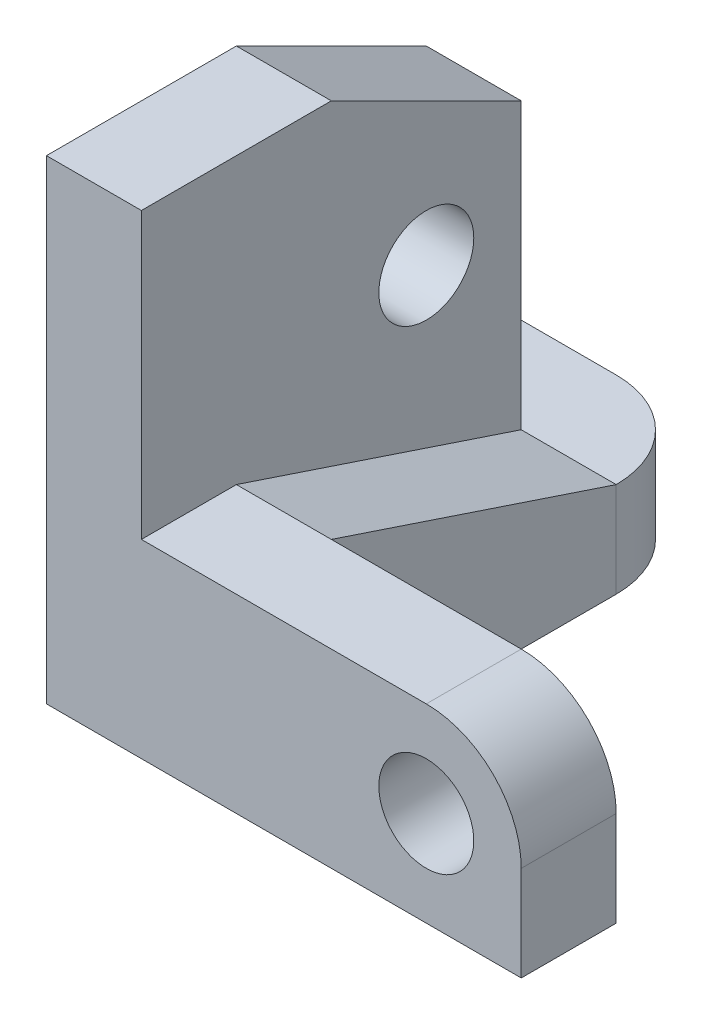
ISO-10303-21;
HEADER;
FILE_DESCRIPTION(('STEP AP214'),'2;1');
FILE_NAME('part.step','',(''),(''),'','','');
FILE_SCHEMA(('AUTOMOTIVE_DESIGN { 1 0 10303 214 1 1 1 1 }'));
ENDSEC;
DATA;
#1=APPLICATION_CONTEXT('core data for automotive mechanical design processes');
#2=APPLICATION_PROTOCOL_DEFINITION('international standard','automotive_design',2000,#1);
#3=PRODUCT_CONTEXT('',#1,'mechanical');
#4=PRODUCT('Part','Part','',(#3));
#5=PRODUCT_RELATED_PRODUCT_CATEGORY('part','',(#4));
#6=PRODUCT_DEFINITION_FORMATION('','',#4);
#7=PRODUCT_DEFINITION_CONTEXT('part definition',#1,'design');
#8=PRODUCT_DEFINITION('design','',#6,#7);
#9=PRODUCT_DEFINITION_SHAPE('','',#8);
#10=(LENGTH_UNIT() NAMED_UNIT(*) SI_UNIT(.MILLI.,.METRE.));
#11=(NAMED_UNIT(*) PLANE_ANGLE_UNIT() SI_UNIT($,.RADIAN.));
#12=(NAMED_UNIT(*) SI_UNIT($,.STERADIAN.) SOLID_ANGLE_UNIT());
#13=UNCERTAINTY_MEASURE_WITH_UNIT(LENGTH_MEASURE(1.E-05),#10,'distance_accuracy_value','');
#14=(GEOMETRIC_REPRESENTATION_CONTEXT(3) GLOBAL_UNCERTAINTY_ASSIGNED_CONTEXT((#13)) GLOBAL_UNIT_ASSIGNED_CONTEXT((#10,
#11,#12)) REPRESENTATION_CONTEXT('',''));
#15=CARTESIAN_POINT('',(0.,0.,0.));
#16=DIRECTION('',(0.,0.,1.));
#17=DIRECTION('',(1.,0.,0.));
#18=AXIS2_PLACEMENT_3D('',#15,#16,#17);
#19=CARTESIAN_POINT('',(50.,0.,20.));
#20=DIRECTION('',(0.,0.,-1.));
#21=DIRECTION('',(0.,1.,0.));
#22=AXIS2_PLACEMENT_3D('',#19,#20,#21);
#23=PLANE('',#22);
#24=CARTESIAN_POINT('',(40.,-20.,20.));
#25=DIRECTION('',(0.,0.,-1.));
#26=DIRECTION('',(0.,1.,0.));
#27=AXIS2_PLACEMENT_3D('',#24,#25,#26);
#28=CIRCLE('',#27,5.);
#29=CARTESIAN_POINT('',(40.,-15.,20.));
#30=VERTEX_POINT('',#29);
#31=EDGE_CURVE('E281',#30,#30,#28,.T.);
#32=ORIENTED_EDGE('',*,*,#31,.F.);
#33=EDGE_LOOP('',(#32));
#34=FACE_BOUND('',#33,.T.);
#35=DIRECTION('',(-1.,0.,0.));
#36=VECTOR('',#35,1.);
#37=CARTESIAN_POINT('',(50.,-10.,20.));
#38=LINE('',#37,#36);
#39=CARTESIAN_POINT('',(40.,-10.,20.));
#40=VERTEX_POINT('',#39);
#41=CARTESIAN_POINT('',(20.,-10.,20.));
#42=VERTEX_POINT('',#41);
#43=EDGE_CURVE('E230',#40,#42,#38,.T.);
#44=ORIENTED_EDGE('',*,*,#43,.F.);
#45=CARTESIAN_POINT('',(40.,-20.,20.));
#46=DIRECTION('',(0.,0.,-1.));
#47=DIRECTION('',(0.,1.,0.));
#48=AXIS2_PLACEMENT_3D('',#45,#46,#47);
#49=CIRCLE('',#48,10.);
#50=CARTESIAN_POINT('',(50.,-20.,20.));
#51=VERTEX_POINT('',#50);
#52=EDGE_CURVE('E223',#40,#51,#49,.T.);
#53=ORIENTED_EDGE('',*,*,#52,.T.);
#54=DIRECTION('',(0.,-1.,0.));
#55=VECTOR('',#54,1.);
#56=CARTESIAN_POINT('',(50.,0.,20.));
#57=LINE('',#56,#55);
#58=CARTESIAN_POINT('',(50.,-30.,20.));
#59=VERTEX_POINT('',#58);
#60=EDGE_CURVE('E243',#51,#59,#57,.T.);
#61=ORIENTED_EDGE('',*,*,#60,.T.);
#62=DIRECTION('',(-1.,0.,0.));
#63=VECTOR('',#62,1.);
#64=CARTESIAN_POINT('',(50.,-30.,20.));
#65=LINE('',#64,#63);
#66=CARTESIAN_POINT('',(20.,-30.,20.));
#67=VERTEX_POINT('',#66);
#68=EDGE_CURVE('E185',#59,#67,#65,.T.);
#69=ORIENTED_EDGE('',*,*,#68,.T.);
#70=DIRECTION('',(0.,-1.,0.));
#71=VECTOR('',#70,1.);
#72=CARTESIAN_POINT('',(20.,0.,20.));
#73=LINE('',#72,#71);
#74=EDGE_CURVE('E179',#42,#67,#73,.T.);
#75=ORIENTED_EDGE('',*,*,#74,.F.);
#76=EDGE_LOOP('',(#44,#53,#61,#69,#75));
#77=FACE_BOUND('',#76,.T.);
#78=ADVANCED_FACE('F34',(#34,#77),#23,.T.);
#79=CARTESIAN_POINT('',(50.,-10.,0.));
#80=DIRECTION('',(0.,1.,0.));
#81=DIRECTION('',(0.,0.,1.));
#82=AXIS2_PLACEMENT_3D('',#79,#80,#81);
#83=PLANE('',#82);
#84=DIRECTION('',(-1.,0.,0.));
#85=VECTOR('',#84,1.);
#86=CARTESIAN_POINT('',(50.,-10.,30.));
#87=LINE('',#86,#85);
#88=CARTESIAN_POINT('',(40.,-10.,30.));
#89=VERTEX_POINT('',#88);
#90=CARTESIAN_POINT('',(10.,-10.,30.));
#91=VERTEX_POINT('',#90);
#92=EDGE_CURVE('E232',#89,#91,#87,.T.);
#93=ORIENTED_EDGE('',*,*,#92,.F.);
#94=DIRECTION('',(0.,0.,-1.));
#95=VECTOR('',#94,1.);
#96=CARTESIAN_POINT('',(40.,-10.,0.));
#97=LINE('',#96,#95);
#98=EDGE_CURVE('E227',#89,#40,#97,.T.);
#99=ORIENTED_EDGE('',*,*,#98,.T.);
#100=ORIENTED_EDGE('',*,*,#43,.T.);
#101=DIRECTION('',(-1.,0.,0.));
#102=VECTOR('',#101,1.);
#103=CARTESIAN_POINT('',(20.,-10.,20.));
#104=LINE('',#103,#102);
#105=CARTESIAN_POINT('',(10.,-10.,20.));
#106=VERTEX_POINT('',#105);
#107=EDGE_CURVE('E190',#42,#106,#104,.T.);
#108=ORIENTED_EDGE('',*,*,#107,.T.);
#109=DIRECTION('',(0.,0.,-1.));
#110=VECTOR('',#109,1.);
#111=CARTESIAN_POINT('',(10.,-10.,0.));
#112=LINE('',#111,#110);
#113=EDGE_CURVE('E275',#91,#106,#112,.T.);
#114=ORIENTED_EDGE('',*,*,#113,.F.);
#115=EDGE_LOOP('',(#93,#99,#100,#108,#114));
#116=FACE_BOUND('',#115,.T.);
#117=ADVANCED_FACE('F276',(#116),#83,.T.);
#118=CARTESIAN_POINT('',(50.,0.,30.));
#119=DIRECTION('',(0.,0.,1.));
#120=DIRECTION('',(0.,-1.,0.));
#121=AXIS2_PLACEMENT_3D('',#118,#119,#120);
#122=PLANE('',#121);
#123=CARTESIAN_POINT('',(40.,-20.,30.));
#124=DIRECTION('',(0.,0.,-1.));
#125=DIRECTION('',(0.,1.,0.));
#126=AXIS2_PLACEMENT_3D('',#123,#124,#125);
#127=CIRCLE('',#126,5.);
#128=CARTESIAN_POINT('',(40.,-15.,30.));
#129=VERTEX_POINT('',#128);
#130=EDGE_CURVE('E162',#129,#129,#127,.T.);
#131=ORIENTED_EDGE('',*,*,#130,.T.);
#132=EDGE_LOOP('',(#131));
#133=FACE_BOUND('',#132,.T.);
#134=DIRECTION('',(0.,1.,0.));
#135=VECTOR('',#134,1.);
#136=CARTESIAN_POINT('',(50.,0.,30.));
#137=LINE('',#136,#135);
#138=CARTESIAN_POINT('',(50.,-30.,30.));
#139=VERTEX_POINT('',#138);
#140=CARTESIAN_POINT('',(50.,-20.,30.));
#141=VERTEX_POINT('',#140);
#142=EDGE_CURVE('E249',#139,#141,#137,.T.);
#143=ORIENTED_EDGE('',*,*,#142,.T.);
#144=CARTESIAN_POINT('',(40.,-20.,30.));
#145=DIRECTION('',(0.,0.,1.));
#146=DIRECTION('',(0.,-1.,0.));
#147=AXIS2_PLACEMENT_3D('',#144,#145,#146);
#148=CIRCLE('',#147,10.);
#149=EDGE_CURVE('E217',#141,#89,#148,.T.);
#150=ORIENTED_EDGE('',*,*,#149,.T.);
#151=ORIENTED_EDGE('',*,*,#92,.T.);
#152=DIRECTION('',(0.,1.,0.));
#153=VECTOR('',#152,1.);
#154=CARTESIAN_POINT('',(10.,0.,30.));
#155=LINE('',#154,#153);
#156=CARTESIAN_POINT('',(10.,20.,30.));
#157=VERTEX_POINT('',#156);
#158=EDGE_CURVE('E152',#91,#157,#155,.T.);
#159=ORIENTED_EDGE('',*,*,#158,.T.);
#160=DIRECTION('',(-1.,0.,0.));
#161=VECTOR('',#160,1.);
#162=CARTESIAN_POINT('',(10.,20.,30.));
#163=LINE('',#162,#161);
#164=CARTESIAN_POINT('',(0.,20.,30.));
#165=VERTEX_POINT('',#164);
#166=EDGE_CURVE('E158',#157,#165,#163,.T.);
#167=ORIENTED_EDGE('',*,*,#166,.T.);
#168=DIRECTION('',(0.,1.,0.));
#169=VECTOR('',#168,1.);
#170=CARTESIAN_POINT('',(0.,0.,30.));
#171=LINE('',#170,#169);
#172=CARTESIAN_POINT('',(0.,-30.,30.));
#173=VERTEX_POINT('',#172);
#174=EDGE_CURVE('E244',#173,#165,#171,.T.);
#175=ORIENTED_EDGE('',*,*,#174,.F.);
#176=DIRECTION('',(-1.,0.,0.));
#177=VECTOR('',#176,1.);
#178=CARTESIAN_POINT('',(50.,-30.,30.));
#179=LINE('',#178,#177);
#180=EDGE_CURVE('E237',#139,#173,#179,.T.);
#181=ORIENTED_EDGE('',*,*,#180,.F.);
#182=EDGE_LOOP('',(#143,#150,#151,#159,#167,#175,#181));
#183=FACE_BOUND('',#182,.T.);
#184=ADVANCED_FACE('F267',(#133,#183),#122,.T.);
#185=CARTESIAN_POINT('',(50.,-30.,0.));
#186=DIRECTION('',(0.,-1.,0.));
#187=DIRECTION('',(0.,0.,-1.));
#188=AXIS2_PLACEMENT_3D('',#185,#186,#187);
#189=PLANE('',#188);
#190=DIRECTION('',(-1.,0.,0.));
#191=VECTOR('',#190,1.);
#192=CARTESIAN_POINT('',(20.,-30.,-20.));
#193=LINE('',#192,#191);
#194=CARTESIAN_POINT('',(10.,-30.,-20.));
#195=VERTEX_POINT('',#194);
#196=CARTESIAN_POINT('',(0.,-30.,-20.));
#197=VERTEX_POINT('',#196);
#198=EDGE_CURVE('E252',#195,#197,#193,.T.);
#199=ORIENTED_EDGE('',*,*,#198,.F.);
#200=CARTESIAN_POINT('',(10.,-30.,-10.));
#201=DIRECTION('',(0.,-1.,0.));
#202=DIRECTION('',(0.,0.,-1.));
#203=AXIS2_PLACEMENT_3D('',#200,#201,#202);
#204=CIRCLE('',#203,10.);
#205=CARTESIAN_POINT('',(20.,-30.,-10.));
#206=VERTEX_POINT('',#205);
#207=EDGE_CURVE('E49',#195,#206,#204,.T.);
#208=ORIENTED_EDGE('',*,*,#207,.T.);
#209=DIRECTION('',(0.,0.,1.));
#210=VECTOR('',#209,1.);
#211=CARTESIAN_POINT('',(20.,-30.,0.));
#212=LINE('',#211,#210);
#213=EDGE_CURVE('E183',#206,#67,#212,.T.);
#214=ORIENTED_EDGE('',*,*,#213,.T.);
#215=ORIENTED_EDGE('',*,*,#68,.F.);
#216=DIRECTION('',(0.,0.,1.));
#217=VECTOR('',#216,1.);
#218=CARTESIAN_POINT('',(50.,-30.,0.));
#219=LINE('',#218,#217);
#220=EDGE_CURVE('E246',#59,#139,#219,.T.);
#221=ORIENTED_EDGE('',*,*,#220,.T.);
#222=ORIENTED_EDGE('',*,*,#180,.T.);
#223=DIRECTION('',(0.,0.,1.));
#224=VECTOR('',#223,1.);
#225=CARTESIAN_POINT('',(0.,-30.,0.));
#226=LINE('',#225,#224);
#227=EDGE_CURVE('E240',#197,#173,#226,.T.);
#228=ORIENTED_EDGE('',*,*,#227,.F.);
#229=EDGE_LOOP('',(#199,#208,#214,#215,#221,#222,#228));
#230=FACE_BOUND('',#229,.T.);
#231=ADVANCED_FACE('F262',(#230),#189,.T.);
#232=CARTESIAN_POINT('',(50.,0.,0.));
#233=DIRECTION('',(1.,0.,0.));
#234=DIRECTION('',(0.,0.,-1.));
#235=AXIS2_PLACEMENT_3D('',#232,#233,#234);
#236=PLANE('',#235);
#237=ORIENTED_EDGE('',*,*,#60,.F.);
#238=DIRECTION('',(0.,0.,-1.));
#239=VECTOR('',#238,1.);
#240=CARTESIAN_POINT('',(50.,-20.,0.));
#241=LINE('',#240,#239);
#242=EDGE_CURVE('E218',#51,#141,#241,.F.);
#243=ORIENTED_EDGE('',*,*,#242,.T.);
#244=ORIENTED_EDGE('',*,*,#142,.F.);
#245=ORIENTED_EDGE('',*,*,#220,.F.);
#246=EDGE_LOOP('',(#237,#243,#244,#245));
#247=FACE_BOUND('',#246,.T.);
#248=ADVANCED_FACE('F305',(#247),#236,.T.);
#249=CARTESIAN_POINT('',(0.,0.,0.));
#250=DIRECTION('',(1.,0.,0.));
#251=DIRECTION('',(0.,0.,-1.));
#252=AXIS2_PLACEMENT_3D('',#249,#250,#251);
#253=PLANE('',#252);
#254=ORIENTED_EDGE('',*,*,#174,.T.);
#255=DIRECTION('',(0.,0.,-1.));
#256=VECTOR('',#255,1.);
#257=CARTESIAN_POINT('',(0.,20.,0.));
#258=LINE('',#257,#256);
#259=CARTESIAN_POINT('',(0.,20.,10.));
#260=VERTEX_POINT('',#259);
#261=EDGE_CURVE('E166',#165,#260,#258,.T.);
#262=ORIENTED_EDGE('',*,*,#261,.T.);
#263=DIRECTION('',(0.,-0.447213595499958,-0.894427190999916));
#264=VECTOR('',#263,1.);
#265=CARTESIAN_POINT('',(0.,12.,-6.));
#266=LINE('',#265,#264);
#267=CARTESIAN_POINT('',(0.,10.,-10.));
#268=VERTEX_POINT('',#267);
#269=EDGE_CURVE('E164',#260,#268,#266,.T.);
#270=ORIENTED_EDGE('',*,*,#269,.T.);
#271=DIRECTION('',(0.,-1.,0.));
#272=VECTOR('',#271,1.);
#273=CARTESIAN_POINT('',(0.,0.,-10.));
#274=LINE('',#273,#272);
#275=CARTESIAN_POINT('',(0.,-20.,-10.));
#276=VERTEX_POINT('',#275);
#277=EDGE_CURVE('E131',#268,#276,#274,.T.);
#278=ORIENTED_EDGE('',*,*,#277,.T.);
#279=DIRECTION('',(0.,0.,-1.));
#280=VECTOR('',#279,1.);
#281=CARTESIAN_POINT('',(0.,-20.,0.));
#282=LINE('',#281,#280);
#283=CARTESIAN_POINT('',(0.,-20.,-20.));
#284=VERTEX_POINT('',#283);
#285=EDGE_CURVE('E214',#276,#284,#282,.T.);
#286=ORIENTED_EDGE('',*,*,#285,.T.);
#287=DIRECTION('',(0.,-1.,0.));
#288=VECTOR('',#287,1.);
#289=CARTESIAN_POINT('',(0.,0.,-20.));
#290=LINE('',#289,#288);
#291=EDGE_CURVE('E174',#284,#197,#290,.T.);
#292=ORIENTED_EDGE('',*,*,#291,.T.);
#293=ORIENTED_EDGE('',*,*,#227,.T.);
#294=EDGE_LOOP('',(#254,#262,#270,#278,#286,#292,#293));
#295=FACE_BOUND('',#294,.T.);
#296=CARTESIAN_POINT('',(0.,0.,0.));
#297=DIRECTION('',(1.,0.,0.));
#298=DIRECTION('',(0.,0.,-1.));
#299=AXIS2_PLACEMENT_3D('',#296,#297,#298);
#300=CIRCLE('',#299,5.);
#301=CARTESIAN_POINT('',(0.,0.,-5.));
#302=VERTEX_POINT('',#301);
#303=EDGE_CURVE('E159',#302,#302,#300,.T.);
#304=ORIENTED_EDGE('',*,*,#303,.T.);
#305=EDGE_LOOP('',(#304));
#306=FACE_BOUND('',#305,.T.);
#307=ADVANCED_FACE('F258',(#295,#306),#253,.F.);
#308=CARTESIAN_POINT('',(20.,-15.,4.99999999999999));
#309=DIRECTION('',(0.,0.948683298050514,-0.316227766016838));
#310=DIRECTION('',(0.,0.316227766016838,0.948683298050514));
#311=AXIS2_PLACEMENT_3D('',#308,#309,#310);
#312=PLANE('',#311);
#313=DIRECTION('',(0.,-0.316227766016838,-0.948683298050514));
#314=VECTOR('',#313,1.);
#315=CARTESIAN_POINT('',(10.,-15.,4.99999999999999));
#316=LINE('',#315,#314);
#317=CARTESIAN_POINT('',(10.,-20.,-10.));
#318=VERTEX_POINT('',#317);
#319=EDGE_CURVE('E147',#106,#318,#316,.T.);
#320=ORIENTED_EDGE('',*,*,#319,.F.);
#321=ORIENTED_EDGE('',*,*,#107,.F.);
#322=DIRECTION('',(0.,-0.316227766016838,-0.948683298050514));
#323=VECTOR('',#322,1.);
#324=CARTESIAN_POINT('',(20.,-15.,4.99999999999999));
#325=LINE('',#324,#323);
#326=CARTESIAN_POINT('',(20.,-20.,-10.));
#327=VERTEX_POINT('',#326);
#328=EDGE_CURVE('E184',#42,#327,#325,.T.);
#329=ORIENTED_EDGE('',*,*,#328,.T.);
#330=DIRECTION('',(-1.,0.,0.));
#331=VECTOR('',#330,1.);
#332=CARTESIAN_POINT('',(20.,-20.,-10.));
#333=LINE('',#332,#331);
#334=EDGE_CURVE('E195',#327,#318,#333,.T.);
#335=ORIENTED_EDGE('',*,*,#334,.T.);
#336=EDGE_LOOP('',(#320,#321,#329,#335));
#337=FACE_BOUND('',#336,.T.);
#338=ADVANCED_FACE('F212',(#337),#312,.T.);
#339=CARTESIAN_POINT('',(20.,0.,-20.));
#340=DIRECTION('',(0.,0.,-1.));
#341=DIRECTION('',(0.,1.,0.));
#342=AXIS2_PLACEMENT_3D('',#339,#340,#341);
#343=PLANE('',#342);
#344=DIRECTION('',(-1.,0.,0.));
#345=VECTOR('',#344,1.);
#346=CARTESIAN_POINT('',(20.,-20.,-20.));
#347=LINE('',#346,#345);
#348=CARTESIAN_POINT('',(10.,-20.,-20.));
#349=VERTEX_POINT('',#348);
#350=EDGE_CURVE('E209',#349,#284,#347,.T.);
#351=ORIENTED_EDGE('',*,*,#350,.F.);
#352=DIRECTION('',(0.,-1.,0.));
#353=VECTOR('',#352,1.);
#354=CARTESIAN_POINT('',(10.,0.,-20.));
#355=LINE('',#354,#353);
#356=EDGE_CURVE('E196',#349,#195,#355,.T.);
#357=ORIENTED_EDGE('',*,*,#356,.T.);
#358=ORIENTED_EDGE('',*,*,#198,.T.);
#359=ORIENTED_EDGE('',*,*,#291,.F.);
#360=EDGE_LOOP('',(#351,#357,#358,#359));
#361=FACE_BOUND('',#360,.T.);
#362=ADVANCED_FACE('F261',(#361),#343,.T.);
#363=CARTESIAN_POINT('',(20.,-20.,0.));
#364=DIRECTION('',(0.,1.,0.));
#365=DIRECTION('',(0.,0.,1.));
#366=AXIS2_PLACEMENT_3D('',#363,#364,#365);
#367=PLANE('',#366);
#368=ORIENTED_EDGE('',*,*,#334,.F.);
#369=CARTESIAN_POINT('',(10.,-20.,-10.));
#370=DIRECTION('',(0.,1.,0.));
#371=DIRECTION('',(0.,0.,1.));
#372=AXIS2_PLACEMENT_3D('',#369,#370,#371);
#373=CIRCLE('',#372,10.);
#374=EDGE_CURVE('E11',#327,#349,#373,.T.);
#375=ORIENTED_EDGE('',*,*,#374,.T.);
#376=ORIENTED_EDGE('',*,*,#350,.T.);
#377=ORIENTED_EDGE('',*,*,#285,.F.);
#378=DIRECTION('',(-1.,0.,0.));
#379=VECTOR('',#378,1.);
#380=CARTESIAN_POINT('',(10.,-20.,-10.));
#381=LINE('',#380,#379);
#382=EDGE_CURVE('E136',#318,#276,#381,.T.);
#383=ORIENTED_EDGE('',*,*,#382,.F.);
#384=EDGE_LOOP('',(#368,#375,#376,#377,#383));
#385=FACE_BOUND('',#384,.T.);
#386=ADVANCED_FACE('F206',(#385),#367,.T.);
#387=CARTESIAN_POINT('',(20.,0.,0.));
#388=DIRECTION('',(1.,0.,0.));
#389=DIRECTION('',(0.,0.,-1.));
#390=AXIS2_PLACEMENT_3D('',#387,#388,#389);
#391=PLANE('',#390);
#392=ORIENTED_EDGE('',*,*,#213,.F.);
#393=DIRECTION('',(0.,-1.,0.));
#394=VECTOR('',#393,1.);
#395=CARTESIAN_POINT('',(20.,0.,-10.));
#396=LINE('',#395,#394);
#397=EDGE_CURVE('E42',#206,#327,#396,.F.);
#398=ORIENTED_EDGE('',*,*,#397,.T.);
#399=ORIENTED_EDGE('',*,*,#328,.F.);
#400=ORIENTED_EDGE('',*,*,#74,.T.);
#401=EDGE_LOOP('',(#392,#398,#399,#400));
#402=FACE_BOUND('',#401,.T.);
#403=ADVANCED_FACE('F201',(#402),#391,.T.);
#404=CARTESIAN_POINT('',(10.,0.,-10.));
#405=DIRECTION('',(0.,0.,-1.));
#406=DIRECTION('',(0.,1.,0.));
#407=AXIS2_PLACEMENT_3D('',#404,#405,#406);
#408=PLANE('',#407);
#409=ORIENTED_EDGE('',*,*,#277,.F.);
#410=DIRECTION('',(-1.,0.,0.));
#411=VECTOR('',#410,1.);
#412=CARTESIAN_POINT('',(10.,10.,-10.));
#413=LINE('',#412,#411);
#414=CARTESIAN_POINT('',(10.,10.,-10.));
#415=VERTEX_POINT('',#414);
#416=EDGE_CURVE('E125',#415,#268,#413,.T.);
#417=ORIENTED_EDGE('',*,*,#416,.F.);
#418=DIRECTION('',(0.,-1.,0.));
#419=VECTOR('',#418,1.);
#420=CARTESIAN_POINT('',(10.,0.,-10.));
#421=LINE('',#420,#419);
#422=EDGE_CURVE('E129',#415,#318,#421,.T.);
#423=ORIENTED_EDGE('',*,*,#422,.T.);
#424=ORIENTED_EDGE('',*,*,#382,.T.);
#425=EDGE_LOOP('',(#409,#417,#423,#424));
#426=FACE_BOUND('',#425,.T.);
#427=ADVANCED_FACE('F127',(#426),#408,.T.);
#428=CARTESIAN_POINT('',(10.,12.,-6.));
#429=DIRECTION('',(0.,0.894427190999916,-0.447213595499958));
#430=DIRECTION('',(0.,0.447213595499958,0.894427190999916));
#431=AXIS2_PLACEMENT_3D('',#428,#429,#430);
#432=PLANE('',#431);
#433=ORIENTED_EDGE('',*,*,#269,.F.);
#434=DIRECTION('',(-1.,0.,0.));
#435=VECTOR('',#434,1.);
#436=CARTESIAN_POINT('',(10.,20.,10.));
#437=LINE('',#436,#435);
#438=CARTESIAN_POINT('',(10.,20.,10.));
#439=VERTEX_POINT('',#438);
#440=EDGE_CURVE('E137',#439,#260,#437,.T.);
#441=ORIENTED_EDGE('',*,*,#440,.F.);
#442=DIRECTION('',(0.,-0.447213595499958,-0.894427190999916));
#443=VECTOR('',#442,1.);
#444=CARTESIAN_POINT('',(10.,12.,-6.));
#445=LINE('',#444,#443);
#446=EDGE_CURVE('E145',#439,#415,#445,.T.);
#447=ORIENTED_EDGE('',*,*,#446,.T.);
#448=ORIENTED_EDGE('',*,*,#416,.T.);
#449=EDGE_LOOP('',(#433,#441,#447,#448));
#450=FACE_BOUND('',#449,.T.);
#451=ADVANCED_FACE('F149',(#450),#432,.T.);
#452=CARTESIAN_POINT('',(10.,20.,0.));
#453=DIRECTION('',(0.,1.,0.));
#454=DIRECTION('',(0.,0.,1.));
#455=AXIS2_PLACEMENT_3D('',#452,#453,#454);
#456=PLANE('',#455);
#457=ORIENTED_EDGE('',*,*,#261,.F.);
#458=ORIENTED_EDGE('',*,*,#166,.F.);
#459=DIRECTION('',(0.,0.,-1.));
#460=VECTOR('',#459,1.);
#461=CARTESIAN_POINT('',(10.,20.,0.));
#462=LINE('',#461,#460);
#463=EDGE_CURVE('E150',#157,#439,#462,.T.);
#464=ORIENTED_EDGE('',*,*,#463,.T.);
#465=ORIENTED_EDGE('',*,*,#440,.T.);
#466=EDGE_LOOP('',(#457,#458,#464,#465));
#467=FACE_BOUND('',#466,.T.);
#468=ADVANCED_FACE('F270',(#467),#456,.T.);
#469=CARTESIAN_POINT('',(10.,0.,0.));
#470=DIRECTION('',(-1.,0.,0.));
#471=DIRECTION('',(0.,0.,1.));
#472=AXIS2_PLACEMENT_3D('',#469,#470,#471);
#473=CYLINDRICAL_SURFACE('',#472,5.);
#474=CARTESIAN_POINT('',(10.,0.,0.));
#475=DIRECTION('',(1.,0.,0.));
#476=DIRECTION('',(0.,0.,-1.));
#477=AXIS2_PLACEMENT_3D('',#474,#475,#476);
#478=CIRCLE('',#477,5.);
#479=CARTESIAN_POINT('',(10.,0.,-5.));
#480=VERTEX_POINT('',#479);
#481=EDGE_CURVE('E169',#480,#480,#478,.T.);
#482=ORIENTED_EDGE('',*,*,#481,.T.);
#483=EDGE_LOOP('',(#482));
#484=FACE_BOUND('',#483,.T.);
#485=ORIENTED_EDGE('',*,*,#303,.F.);
#486=EDGE_LOOP('',(#485));
#487=FACE_BOUND('',#486,.T.);
#488=ADVANCED_FACE('F325',(#484,#487),#473,.F.);
#489=CARTESIAN_POINT('',(10.,0.,0.));
#490=DIRECTION('',(1.,0.,0.));
#491=DIRECTION('',(0.,0.,-1.));
#492=AXIS2_PLACEMENT_3D('',#489,#490,#491);
#493=PLANE('',#492);
#494=ORIENTED_EDGE('',*,*,#481,.F.);
#495=EDGE_LOOP('',(#494));
#496=FACE_BOUND('',#495,.T.);
#497=ORIENTED_EDGE('',*,*,#113,.T.);
#498=ORIENTED_EDGE('',*,*,#319,.T.);
#499=ORIENTED_EDGE('',*,*,#422,.F.);
#500=ORIENTED_EDGE('',*,*,#446,.F.);
#501=ORIENTED_EDGE('',*,*,#463,.F.);
#502=ORIENTED_EDGE('',*,*,#158,.F.);
#503=EDGE_LOOP('',(#497,#498,#499,#500,#501,#502));
#504=FACE_BOUND('',#503,.T.);
#505=ADVANCED_FACE('F143',(#496,#504),#493,.T.);
#506=CARTESIAN_POINT('',(40.,-20.,0.));
#507=DIRECTION('',(0.,0.,-1.));
#508=DIRECTION('',(-1.,0.,0.));
#509=AXIS2_PLACEMENT_3D('',#506,#507,#508);
#510=CYLINDRICAL_SURFACE('',#509,10.);
#511=ORIENTED_EDGE('',*,*,#149,.F.);
#512=ORIENTED_EDGE('',*,*,#242,.F.);
#513=ORIENTED_EDGE('',*,*,#52,.F.);
#514=ORIENTED_EDGE('',*,*,#98,.F.);
#515=EDGE_LOOP('',(#511,#512,#513,#514));
#516=FACE_BOUND('',#515,.T.);
#517=ADVANCED_FACE('F302',(#516),#510,.T.);
#518=CARTESIAN_POINT('',(10.,0.,-10.));
#519=DIRECTION('',(0.,-1.,0.));
#520=DIRECTION('',(0.,0.,-1.));
#521=AXIS2_PLACEMENT_3D('',#518,#519,#520);
#522=CYLINDRICAL_SURFACE('',#521,10.);
#523=ORIENTED_EDGE('',*,*,#374,.F.);
#524=ORIENTED_EDGE('',*,*,#397,.F.);
#525=ORIENTED_EDGE('',*,*,#207,.F.);
#526=ORIENTED_EDGE('',*,*,#356,.F.);
#527=EDGE_LOOP('',(#523,#524,#525,#526));
#528=FACE_BOUND('',#527,.T.);
#529=ADVANCED_FACE('F36',(#528),#522,.T.);
#530=CARTESIAN_POINT('',(40.,-20.,30.));
#531=DIRECTION('',(0.,0.,-1.));
#532=DIRECTION('',(0.,1.,0.));
#533=AXIS2_PLACEMENT_3D('',#530,#531,#532);
#534=CYLINDRICAL_SURFACE('',#533,5.);
#535=ORIENTED_EDGE('',*,*,#130,.F.);
#536=EDGE_LOOP('',(#535));
#537=FACE_BOUND('',#536,.T.);
#538=ORIENTED_EDGE('',*,*,#31,.T.);
#539=EDGE_LOOP('',(#538));
#540=FACE_BOUND('',#539,.T.);
#541=ADVANCED_FACE('F288',(#537,#540),#534,.F.);
#542=CLOSED_SHELL('',(#78,#117,#184,#231,#248,#307,#338,#362,#386,#403,#427,#451,#468,#488,#505,
#517,#529,#541));
#543=MANIFOLD_SOLID_BREP('B2',#542);
#544=ADVANCED_BREP_SHAPE_REPRESENTATION('',(#18,#543),#14);
#545=SHAPE_DEFINITION_REPRESENTATION(#9,#544);
ENDSEC;
END-ISO-10303-21;
